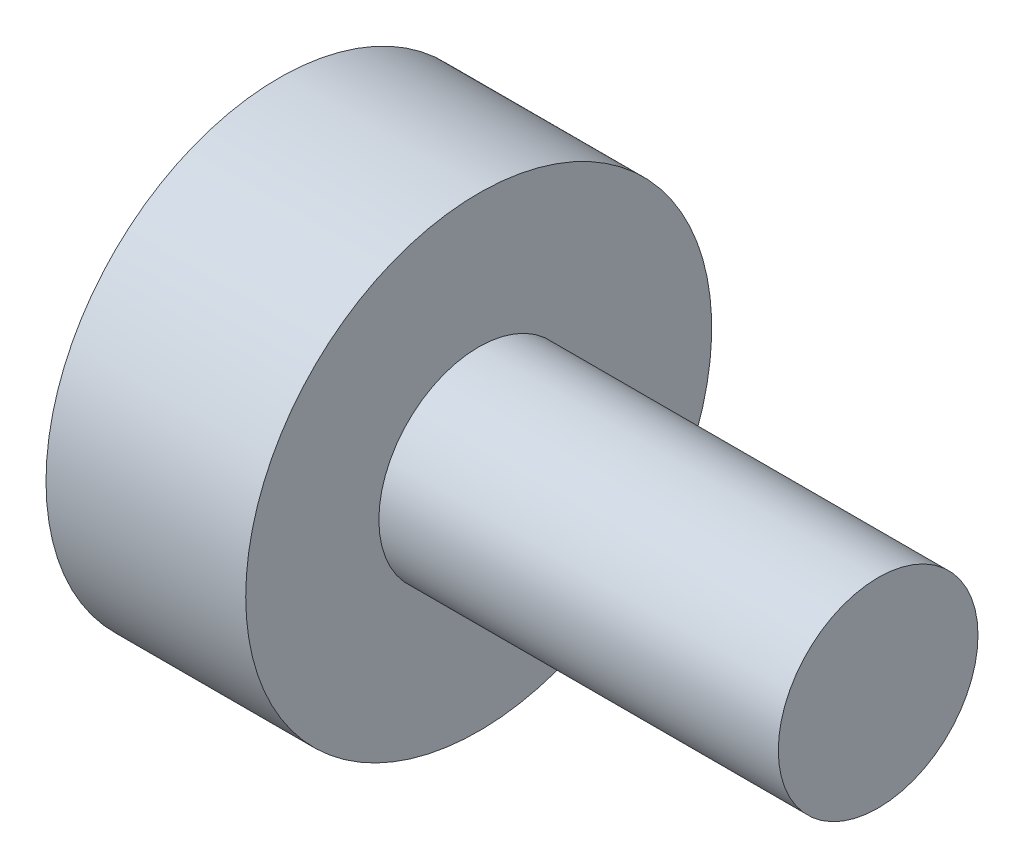
ISO-10303-21;
HEADER;
FILE_DESCRIPTION(('STEP AP214'),'2;1');
FILE_NAME('part.step','',(''),(''),'','','');
FILE_SCHEMA(('AUTOMOTIVE_DESIGN { 1 0 10303 214 1 1 1 1 }'));
ENDSEC;
DATA;
#1=APPLICATION_CONTEXT('core data for automotive mechanical design processes');
#2=APPLICATION_PROTOCOL_DEFINITION('international standard','automotive_design',2000,#1);
#3=PRODUCT_CONTEXT('',#1,'mechanical');
#4=PRODUCT('Part','Part','',(#3));
#5=PRODUCT_RELATED_PRODUCT_CATEGORY('part','',(#4));
#6=PRODUCT_DEFINITION_FORMATION('','',#4);
#7=PRODUCT_DEFINITION_CONTEXT('part definition',#1,'design');
#8=PRODUCT_DEFINITION('design','',#6,#7);
#9=PRODUCT_DEFINITION_SHAPE('','',#8);
#10=(LENGTH_UNIT() NAMED_UNIT(*) SI_UNIT(.MILLI.,.METRE.));
#11=(NAMED_UNIT(*) PLANE_ANGLE_UNIT() SI_UNIT($,.RADIAN.));
#12=(NAMED_UNIT(*) SI_UNIT($,.STERADIAN.) SOLID_ANGLE_UNIT());
#13=UNCERTAINTY_MEASURE_WITH_UNIT(LENGTH_MEASURE(1.E-05),#10,'distance_accuracy_value','');
#14=(GEOMETRIC_REPRESENTATION_CONTEXT(3) GLOBAL_UNCERTAINTY_ASSIGNED_CONTEXT((#13)) GLOBAL_UNIT_ASSIGNED_CONTEXT((#10,
#11,#12)) REPRESENTATION_CONTEXT('',''));
#15=CARTESIAN_POINT('',(0.,0.,0.));
#16=DIRECTION('',(0.,0.,1.));
#17=DIRECTION('',(1.,0.,0.));
#18=AXIS2_PLACEMENT_3D('',#15,#16,#17);
#19=CARTESIAN_POINT('',(0.,0.,0.));
#20=DIRECTION('',(1.,0.,0.));
#21=DIRECTION('',(0.,0.,-1.));
#22=AXIS2_PLACEMENT_3D('',#19,#20,#21);
#23=PLANE('',#22);
#24=CARTESIAN_POINT('',(0.,10.,0.));
#25=DIRECTION('',(1.,0.,0.));
#26=DIRECTION('',(0.,0.,-1.));
#27=AXIS2_PLACEMENT_3D('',#24,#25,#26);
#28=CIRCLE('',#27,5.);
#29=CARTESIAN_POINT('',(0.,10.,-5.));
#30=VERTEX_POINT('',#29);
#31=EDGE_CURVE('E63',#30,#30,#28,.T.);
#32=ORIENTED_EDGE('',*,*,#31,.T.);
#33=EDGE_LOOP('',(#32));
#34=FACE_BOUND('',#33,.T.);
#35=CARTESIAN_POINT('',(0.,0.,0.));
#36=DIRECTION('',(-1.,0.,0.));
#37=DIRECTION('',(0.,0.,1.));
#38=AXIS2_PLACEMENT_3D('',#35,#36,#37);
#39=CIRCLE('',#38,20.);
#40=CARTESIAN_POINT('',(0.,0.,20.));
#41=VERTEX_POINT('',#40);
#42=EDGE_CURVE('E10',#41,#41,#39,.T.);
#43=ORIENTED_EDGE('',*,*,#42,.T.);
#44=EDGE_LOOP('',(#43));
#45=FACE_BOUND('',#44,.T.);
#46=ADVANCED_FACE('F37',(#34,#45),#23,.F.);
#47=CARTESIAN_POINT('',(0.,0.,0.));
#48=DIRECTION('',(-1.,0.,0.));
#49=DIRECTION('',(0.,0.,1.));
#50=AXIS2_PLACEMENT_3D('',#47,#48,#49);
#51=CYLINDRICAL_SURFACE('',#50,20.);
#52=ORIENTED_EDGE('',*,*,#42,.F.);
#53=EDGE_LOOP('',(#52));
#54=FACE_BOUND('',#53,.T.);
#55=CARTESIAN_POINT('',(10.,0.,0.));
#56=DIRECTION('',(-1.,0.,0.));
#57=DIRECTION('',(0.,0.,1.));
#58=AXIS2_PLACEMENT_3D('',#55,#56,#57);
#59=CIRCLE('',#58,20.);
#60=CARTESIAN_POINT('',(10.,0.,20.));
#61=VERTEX_POINT('',#60);
#62=EDGE_CURVE('E43',#61,#61,#59,.T.);
#63=ORIENTED_EDGE('',*,*,#62,.T.);
#64=EDGE_LOOP('',(#63));
#65=FACE_BOUND('',#64,.T.);
#66=ADVANCED_FACE('F81',(#54,#65),#51,.T.);
#67=CARTESIAN_POINT('',(10.,20.,0.));
#68=DIRECTION('',(1.,0.,0.));
#69=DIRECTION('',(0.,0.,-1.));
#70=AXIS2_PLACEMENT_3D('',#67,#68,#69);
#71=PLANE('',#70);
#72=ORIENTED_EDGE('',*,*,#62,.F.);
#73=EDGE_LOOP('',(#72));
#74=FACE_BOUND('',#73,.T.);
#75=CARTESIAN_POINT('',(10.,0.,0.));
#76=DIRECTION('',(-1.,0.,0.));
#77=DIRECTION('',(0.,0.,1.));
#78=AXIS2_PLACEMENT_3D('',#75,#76,#77);
#79=CIRCLE('',#78,35.);
#80=CARTESIAN_POINT('',(10.,0.,35.));
#81=VERTEX_POINT('',#80);
#82=EDGE_CURVE('E47',#81,#81,#79,.T.);
#83=ORIENTED_EDGE('',*,*,#82,.T.);
#84=EDGE_LOOP('',(#83));
#85=FACE_BOUND('',#84,.T.);
#86=ADVANCED_FACE('F87',(#74,#85),#71,.F.);
#87=CARTESIAN_POINT('',(0.,0.,0.));
#88=DIRECTION('',(-1.,0.,0.));
#89=DIRECTION('',(0.,0.,1.));
#90=AXIS2_PLACEMENT_3D('',#87,#88,#89);
#91=CYLINDRICAL_SURFACE('',#90,35.);
#92=ORIENTED_EDGE('',*,*,#82,.F.);
#93=EDGE_LOOP('',(#92));
#94=FACE_BOUND('',#93,.T.);
#95=CARTESIAN_POINT('',(40.,0.,0.));
#96=DIRECTION('',(-1.,0.,0.));
#97=DIRECTION('',(0.,0.,1.));
#98=AXIS2_PLACEMENT_3D('',#95,#96,#97);
#99=CIRCLE('',#98,35.);
#100=CARTESIAN_POINT('',(40.,0.,35.));
#101=VERTEX_POINT('',#100);
#102=EDGE_CURVE('E51',#101,#101,#99,.T.);
#103=ORIENTED_EDGE('',*,*,#102,.T.);
#104=EDGE_LOOP('',(#103));
#105=FACE_BOUND('',#104,.T.);
#106=ADVANCED_FACE('F93',(#94,#105),#91,.T.);
#107=CARTESIAN_POINT('',(40.,35.,0.));
#108=DIRECTION('',(-1.,0.,0.));
#109=DIRECTION('',(0.,0.,1.));
#110=AXIS2_PLACEMENT_3D('',#107,#108,#109);
#111=PLANE('',#110);
#112=ORIENTED_EDGE('',*,*,#102,.F.);
#113=EDGE_LOOP('',(#112));
#114=FACE_BOUND('',#113,.T.);
#115=CARTESIAN_POINT('',(40.,0.,0.));
#116=DIRECTION('',(-1.,0.,0.));
#117=DIRECTION('',(0.,0.,1.));
#118=AXIS2_PLACEMENT_3D('',#115,#116,#117);
#119=CIRCLE('',#118,15.);
#120=CARTESIAN_POINT('',(40.,0.,15.));
#121=VERTEX_POINT('',#120);
#122=EDGE_CURVE('E56',#121,#121,#119,.T.);
#123=ORIENTED_EDGE('',*,*,#122,.T.);
#124=EDGE_LOOP('',(#123));
#125=FACE_BOUND('',#124,.T.);
#126=ADVANCED_FACE('F99',(#114,#125),#111,.F.);
#127=CARTESIAN_POINT('',(0.,0.,0.));
#128=DIRECTION('',(-1.,0.,0.));
#129=DIRECTION('',(0.,0.,1.));
#130=AXIS2_PLACEMENT_3D('',#127,#128,#129);
#131=CYLINDRICAL_SURFACE('',#130,15.);
#132=ORIENTED_EDGE('',*,*,#122,.F.);
#133=EDGE_LOOP('',(#132));
#134=FACE_BOUND('',#133,.T.);
#135=CARTESIAN_POINT('',(100.,0.,0.));
#136=DIRECTION('',(-1.,0.,0.));
#137=DIRECTION('',(0.,0.,1.));
#138=AXIS2_PLACEMENT_3D('',#135,#136,#137);
#139=CIRCLE('',#138,15.);
#140=CARTESIAN_POINT('',(100.,0.,15.));
#141=VERTEX_POINT('',#140);
#142=EDGE_CURVE('E59',#141,#141,#139,.T.);
#143=ORIENTED_EDGE('',*,*,#142,.T.);
#144=EDGE_LOOP('',(#143));
#145=FACE_BOUND('',#144,.T.);
#146=ADVANCED_FACE('F103',(#134,#145),#131,.T.);
#147=CARTESIAN_POINT('',(100.,0.,0.));
#148=DIRECTION('',(-1.,0.,0.));
#149=DIRECTION('',(0.,0.,1.));
#150=AXIS2_PLACEMENT_3D('',#147,#148,#149);
#151=PLANE('',#150);
#152=ORIENTED_EDGE('',*,*,#142,.F.);
#153=EDGE_LOOP('',(#152));
#154=FACE_BOUND('',#153,.T.);
#155=ADVANCED_FACE('F78',(#154),#151,.F.);
#156=CARTESIAN_POINT('',(20.,10.,0.));
#157=DIRECTION('',(-1.,0.,0.));
#158=DIRECTION('',(0.,0.,1.));
#159=AXIS2_PLACEMENT_3D('',#156,#157,#158);
#160=CYLINDRICAL_SURFACE('',#159,5.);
#161=CARTESIAN_POINT('',(20.,10.,0.));
#162=DIRECTION('',(1.,0.,0.));
#163=DIRECTION('',(0.,0.,-1.));
#164=AXIS2_PLACEMENT_3D('',#161,#162,#163);
#165=CIRCLE('',#164,5.);
#166=CARTESIAN_POINT('',(20.,10.,-5.));
#167=VERTEX_POINT('',#166);
#168=EDGE_CURVE('E62',#167,#167,#165,.T.);
#169=ORIENTED_EDGE('',*,*,#168,.T.);
#170=EDGE_LOOP('',(#169));
#171=FACE_BOUND('',#170,.T.);
#172=ORIENTED_EDGE('',*,*,#31,.F.);
#173=EDGE_LOOP('',(#172));
#174=FACE_BOUND('',#173,.T.);
#175=ADVANCED_FACE('F69',(#171,#174),#160,.F.);
#176=CARTESIAN_POINT('',(20.,10.,0.));
#177=DIRECTION('',(1.,0.,0.));
#178=DIRECTION('',(0.,0.,-1.));
#179=AXIS2_PLACEMENT_3D('',#176,#177,#178);
#180=PLANE('',#179);
#181=ORIENTED_EDGE('',*,*,#168,.F.);
#182=EDGE_LOOP('',(#181));
#183=FACE_BOUND('',#182,.T.);
#184=ADVANCED_FACE('F72',(#183),#180,.F.);
#185=CLOSED_SHELL('',(#46,#66,#86,#106,#126,#146,#155,#175,#184));
#186=MANIFOLD_SOLID_BREP('B2',#185);
#187=ADVANCED_BREP_SHAPE_REPRESENTATION('',(#18,#186),#14);
#188=SHAPE_DEFINITION_REPRESENTATION(#9,#187);
ENDSEC;
END-ISO-10303-21;
